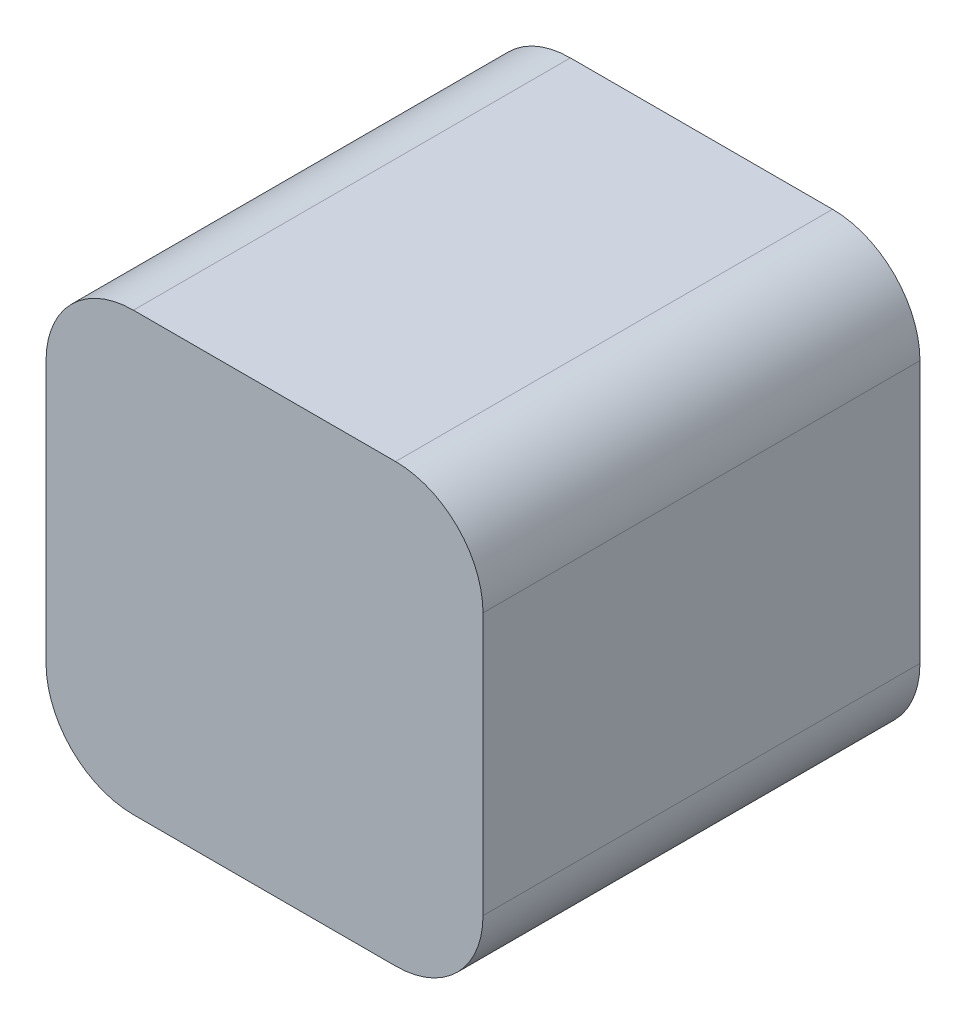
ISO-10303-21;
HEADER;
FILE_DESCRIPTION(('STEP AP214'),'2;1');
FILE_NAME('part.step','',(''),(''),'','','');
FILE_SCHEMA(('AUTOMOTIVE_DESIGN { 1 0 10303 214 1 1 1 1 }'));
ENDSEC;
DATA;
#1=APPLICATION_CONTEXT('core data for automotive mechanical design processes');
#2=APPLICATION_PROTOCOL_DEFINITION('international standard','automotive_design',2000,#1);
#3=PRODUCT_CONTEXT('',#1,'mechanical');
#4=PRODUCT('Part','Part','',(#3));
#5=PRODUCT_RELATED_PRODUCT_CATEGORY('part','',(#4));
#6=PRODUCT_DEFINITION_FORMATION('','',#4);
#7=PRODUCT_DEFINITION_CONTEXT('part definition',#1,'design');
#8=PRODUCT_DEFINITION('design','',#6,#7);
#9=PRODUCT_DEFINITION_SHAPE('','',#8);
#10=(LENGTH_UNIT() NAMED_UNIT(*) SI_UNIT(.MILLI.,.METRE.));
#11=(NAMED_UNIT(*) PLANE_ANGLE_UNIT() SI_UNIT($,.RADIAN.));
#12=(NAMED_UNIT(*) SI_UNIT($,.STERADIAN.) SOLID_ANGLE_UNIT());
#13=UNCERTAINTY_MEASURE_WITH_UNIT(LENGTH_MEASURE(1.E-05),#10,'distance_accuracy_value','');
#14=(GEOMETRIC_REPRESENTATION_CONTEXT(3) GLOBAL_UNCERTAINTY_ASSIGNED_CONTEXT((#13)) GLOBAL_UNIT_ASSIGNED_CONTEXT((#10,
#11,#12)) REPRESENTATION_CONTEXT('',''));
#15=CARTESIAN_POINT('',(0.,0.,0.));
#16=DIRECTION('',(0.,0.,1.));
#17=DIRECTION('',(1.,0.,0.));
#18=AXIS2_PLACEMENT_3D('',#15,#16,#17);
#19=CARTESIAN_POINT('',(50.,0.,0.));
#20=DIRECTION('',(0.,0.,-1.));
#21=DIRECTION('',(-1.,0.,0.));
#22=AXIS2_PLACEMENT_3D('',#19,#20,#21);
#23=PLANE('',#22);
#24=DIRECTION('',(0.,-1.,0.));
#25=VECTOR('',#24,1.);
#26=CARTESIAN_POINT('',(50.,0.,0.));
#27=LINE('',#26,#25);
#28=CARTESIAN_POINT('',(50.,40.,0.));
#29=VERTEX_POINT('',#28);
#30=CARTESIAN_POINT('',(50.,10.,0.));
#31=VERTEX_POINT('',#30);
#32=EDGE_CURVE('E116',#29,#31,#27,.T.);
#33=ORIENTED_EDGE('',*,*,#32,.F.);
#34=CARTESIAN_POINT('',(40.,40.,0.));
#35=DIRECTION('',(0.,0.,-1.));
#36=DIRECTION('',(-1.,0.,0.));
#37=AXIS2_PLACEMENT_3D('',#34,#35,#36);
#38=CIRCLE('',#37,10.);
#39=CARTESIAN_POINT('',(40.,50.,0.));
#40=VERTEX_POINT('',#39);
#41=EDGE_CURVE('E98',#29,#40,#38,.F.);
#42=ORIENTED_EDGE('',*,*,#41,.T.);
#43=DIRECTION('',(-1.,0.,0.));
#44=VECTOR('',#43,1.);
#45=CARTESIAN_POINT('',(50.,50.,0.));
#46=LINE('',#45,#44);
#47=CARTESIAN_POINT('',(10.,50.,0.));
#48=VERTEX_POINT('',#47);
#49=EDGE_CURVE('E126',#40,#48,#46,.T.);
#50=ORIENTED_EDGE('',*,*,#49,.T.);
#51=CARTESIAN_POINT('',(10.,40.,0.));
#52=DIRECTION('',(0.,0.,-1.));
#53=DIRECTION('',(-1.,0.,0.));
#54=AXIS2_PLACEMENT_3D('',#51,#52,#53);
#55=CIRCLE('',#54,10.);
#56=CARTESIAN_POINT('',(0.,40.,0.));
#57=VERTEX_POINT('',#56);
#58=EDGE_CURVE('E119',#48,#57,#55,.F.);
#59=ORIENTED_EDGE('',*,*,#58,.T.);
#60=DIRECTION('',(0.,-1.,0.));
#61=VECTOR('',#60,1.);
#62=CARTESIAN_POINT('',(0.,0.,0.));
#63=LINE('',#62,#61);
#64=CARTESIAN_POINT('',(0.,10.,0.));
#65=VERTEX_POINT('',#64);
#66=EDGE_CURVE('E129',#57,#65,#63,.T.);
#67=ORIENTED_EDGE('',*,*,#66,.T.);
#68=CARTESIAN_POINT('',(10.,10.,0.));
#69=DIRECTION('',(0.,0.,-1.));
#70=DIRECTION('',(-1.,0.,0.));
#71=AXIS2_PLACEMENT_3D('',#68,#69,#70);
#72=CIRCLE('',#71,10.);
#73=CARTESIAN_POINT('',(10.,0.,0.));
#74=VERTEX_POINT('',#73);
#75=EDGE_CURVE('E145',#65,#74,#72,.F.);
#76=ORIENTED_EDGE('',*,*,#75,.T.);
#77=DIRECTION('',(-1.,0.,0.));
#78=VECTOR('',#77,1.);
#79=CARTESIAN_POINT('',(50.,0.,0.));
#80=LINE('',#79,#78);
#81=CARTESIAN_POINT('',(40.,0.,0.));
#82=VERTEX_POINT('',#81);
#83=EDGE_CURVE('E140',#82,#74,#80,.T.);
#84=ORIENTED_EDGE('',*,*,#83,.F.);
#85=CARTESIAN_POINT('',(40.,10.,0.));
#86=DIRECTION('',(0.,0.,-1.));
#87=DIRECTION('',(-1.,0.,0.));
#88=AXIS2_PLACEMENT_3D('',#85,#86,#87);
#89=CIRCLE('',#88,10.);
#90=EDGE_CURVE('E109',#82,#31,#89,.F.);
#91=ORIENTED_EDGE('',*,*,#90,.T.);
#92=EDGE_LOOP('',(#33,#42,#50,#59,#67,#76,#84,#91));
#93=FACE_BOUND('',#92,.T.);
#94=ADVANCED_FACE('F32',(#93),#23,.F.);
#95=CARTESIAN_POINT('',(50.,0.,0.));
#96=DIRECTION('',(0.,1.,0.));
#97=DIRECTION('',(0.,0.,1.));
#98=AXIS2_PLACEMENT_3D('',#95,#96,#97);
#99=PLANE('',#98);
#100=DIRECTION('',(-1.,0.,0.));
#101=VECTOR('',#100,1.);
#102=CARTESIAN_POINT('',(50.,0.,-50.));
#103=LINE('',#102,#101);
#104=CARTESIAN_POINT('',(40.,0.,-50.));
#105=VERTEX_POINT('',#104);
#106=CARTESIAN_POINT('',(10.,0.,-50.));
#107=VERTEX_POINT('',#106);
#108=EDGE_CURVE('E138',#105,#107,#103,.T.);
#109=ORIENTED_EDGE('',*,*,#108,.F.);
#110=DIRECTION('',(0.,0.,-1.));
#111=VECTOR('',#110,1.);
#112=CARTESIAN_POINT('',(40.,0.,0.));
#113=LINE('',#112,#111);
#114=EDGE_CURVE('E159',#105,#82,#113,.F.);
#115=ORIENTED_EDGE('',*,*,#114,.T.);
#116=ORIENTED_EDGE('',*,*,#83,.T.);
#117=DIRECTION('',(0.,0.,-1.));
#118=VECTOR('',#117,1.);
#119=CARTESIAN_POINT('',(10.,0.,-50.));
#120=LINE('',#119,#118);
#121=EDGE_CURVE('E157',#74,#107,#120,.T.);
#122=ORIENTED_EDGE('',*,*,#121,.T.);
#123=EDGE_LOOP('',(#109,#115,#116,#122));
#124=FACE_BOUND('',#123,.T.);
#125=ADVANCED_FACE('F175',(#124),#99,.F.);
#126=CARTESIAN_POINT('',(50.,0.,-50.));
#127=DIRECTION('',(0.,0.,1.));
#128=DIRECTION('',(1.,0.,0.));
#129=AXIS2_PLACEMENT_3D('',#126,#127,#128);
#130=PLANE('',#129);
#131=DIRECTION('',(-1.,0.,0.));
#132=VECTOR('',#131,1.);
#133=CARTESIAN_POINT('',(50.,50.,-50.));
#134=LINE('',#133,#132);
#135=CARTESIAN_POINT('',(40.,50.,-50.));
#136=VERTEX_POINT('',#135);
#137=CARTESIAN_POINT('',(10.,50.,-50.));
#138=VERTEX_POINT('',#137);
#139=EDGE_CURVE('E135',#136,#138,#134,.T.);
#140=ORIENTED_EDGE('',*,*,#139,.F.);
#141=CARTESIAN_POINT('',(40.,40.,-50.));
#142=DIRECTION('',(0.,0.,1.));
#143=DIRECTION('',(1.,0.,0.));
#144=AXIS2_PLACEMENT_3D('',#141,#142,#143);
#145=CIRCLE('',#144,10.);
#146=CARTESIAN_POINT('',(50.,40.,-50.));
#147=VERTEX_POINT('',#146);
#148=EDGE_CURVE('E155',#136,#147,#145,.F.);
#149=ORIENTED_EDGE('',*,*,#148,.T.);
#150=DIRECTION('',(0.,1.,0.));
#151=VECTOR('',#150,1.);
#152=CARTESIAN_POINT('',(50.,0.,-50.));
#153=LINE('',#152,#151);
#154=CARTESIAN_POINT('',(50.,10.,-50.));
#155=VERTEX_POINT('',#154);
#156=EDGE_CURVE('E118',#155,#147,#153,.T.);
#157=ORIENTED_EDGE('',*,*,#156,.F.);
#158=CARTESIAN_POINT('',(40.,10.,-50.));
#159=DIRECTION('',(0.,0.,1.));
#160=DIRECTION('',(1.,0.,0.));
#161=AXIS2_PLACEMENT_3D('',#158,#159,#160);
#162=CIRCLE('',#161,10.);
#163=EDGE_CURVE('E55',#155,#105,#162,.F.);
#164=ORIENTED_EDGE('',*,*,#163,.T.);
#165=ORIENTED_EDGE('',*,*,#108,.T.);
#166=CARTESIAN_POINT('',(10.,10.,-50.));
#167=DIRECTION('',(0.,0.,1.));
#168=DIRECTION('',(1.,0.,0.));
#169=AXIS2_PLACEMENT_3D('',#166,#167,#168);
#170=CIRCLE('',#169,10.);
#171=CARTESIAN_POINT('',(0.,10.,-50.));
#172=VERTEX_POINT('',#171);
#173=EDGE_CURVE('E47',#107,#172,#170,.F.);
#174=ORIENTED_EDGE('',*,*,#173,.T.);
#175=DIRECTION('',(0.,1.,0.));
#176=VECTOR('',#175,1.);
#177=CARTESIAN_POINT('',(0.,0.,-50.));
#178=LINE('',#177,#176);
#179=CARTESIAN_POINT('',(0.,40.,-50.));
#180=VERTEX_POINT('',#179);
#181=EDGE_CURVE('E124',#172,#180,#178,.T.);
#182=ORIENTED_EDGE('',*,*,#181,.T.);
#183=CARTESIAN_POINT('',(10.,40.,-50.));
#184=DIRECTION('',(0.,0.,1.));
#185=DIRECTION('',(1.,0.,0.));
#186=AXIS2_PLACEMENT_3D('',#183,#184,#185);
#187=CIRCLE('',#186,10.);
#188=EDGE_CURVE('E151',#180,#138,#187,.F.);
#189=ORIENTED_EDGE('',*,*,#188,.T.);
#190=EDGE_LOOP('',(#140,#149,#157,#164,#165,#174,#182,#189));
#191=FACE_BOUND('',#190,.T.);
#192=ADVANCED_FACE('F168',(#191),#130,.F.);
#193=CARTESIAN_POINT('',(50.,50.,0.));
#194=DIRECTION('',(0.,-1.,0.));
#195=DIRECTION('',(0.,0.,-1.));
#196=AXIS2_PLACEMENT_3D('',#193,#194,#195);
#197=PLANE('',#196);
#198=ORIENTED_EDGE('',*,*,#49,.F.);
#199=DIRECTION('',(0.,0.,1.));
#200=VECTOR('',#199,1.);
#201=CARTESIAN_POINT('',(40.,50.,0.));
#202=LINE('',#201,#200);
#203=EDGE_CURVE('E103',#40,#136,#202,.F.);
#204=ORIENTED_EDGE('',*,*,#203,.T.);
#205=ORIENTED_EDGE('',*,*,#139,.T.);
#206=DIRECTION('',(0.,0.,1.));
#207=VECTOR('',#206,1.);
#208=CARTESIAN_POINT('',(10.,50.,0.));
#209=LINE('',#208,#207);
#210=EDGE_CURVE('E108',#138,#48,#209,.T.);
#211=ORIENTED_EDGE('',*,*,#210,.T.);
#212=EDGE_LOOP('',(#198,#204,#205,#211));
#213=FACE_BOUND('',#212,.T.);
#214=ADVANCED_FACE('F171',(#213),#197,.F.);
#215=CARTESIAN_POINT('',(50.,0.,0.));
#216=DIRECTION('',(-1.,0.,0.));
#217=DIRECTION('',(0.,0.,1.));
#218=AXIS2_PLACEMENT_3D('',#215,#216,#217);
#219=PLANE('',#218);
#220=ORIENTED_EDGE('',*,*,#156,.T.);
#221=DIRECTION('',(0.,0.,1.));
#222=VECTOR('',#221,1.);
#223=CARTESIAN_POINT('',(50.,40.,0.));
#224=LINE('',#223,#222);
#225=EDGE_CURVE('E102',#147,#29,#224,.T.);
#226=ORIENTED_EDGE('',*,*,#225,.T.);
#227=ORIENTED_EDGE('',*,*,#32,.T.);
#228=DIRECTION('',(0.,0.,-1.));
#229=VECTOR('',#228,1.);
#230=CARTESIAN_POINT('',(50.,10.,0.));
#231=LINE('',#230,#229);
#232=EDGE_CURVE('E120',#31,#155,#231,.T.);
#233=ORIENTED_EDGE('',*,*,#232,.T.);
#234=EDGE_LOOP('',(#220,#226,#227,#233));
#235=FACE_BOUND('',#234,.T.);
#236=ADVANCED_FACE('F114',(#235),#219,.F.);
#237=CARTESIAN_POINT('',(0.,0.,0.));
#238=DIRECTION('',(-1.,0.,0.));
#239=DIRECTION('',(0.,0.,1.));
#240=AXIS2_PLACEMENT_3D('',#237,#238,#239);
#241=PLANE('',#240);
#242=ORIENTED_EDGE('',*,*,#181,.F.);
#243=DIRECTION('',(0.,0.,-1.));
#244=VECTOR('',#243,1.);
#245=CARTESIAN_POINT('',(0.,10.,0.));
#246=LINE('',#245,#244);
#247=EDGE_CURVE('E11',#172,#65,#246,.F.);
#248=ORIENTED_EDGE('',*,*,#247,.T.);
#249=ORIENTED_EDGE('',*,*,#66,.F.);
#250=DIRECTION('',(0.,0.,1.));
#251=VECTOR('',#250,1.);
#252=CARTESIAN_POINT('',(0.,40.,-50.));
#253=LINE('',#252,#251);
#254=EDGE_CURVE('E40',#57,#180,#253,.F.);
#255=ORIENTED_EDGE('',*,*,#254,.T.);
#256=EDGE_LOOP('',(#242,#248,#249,#255));
#257=FACE_BOUND('',#256,.T.);
#258=ADVANCED_FACE('F164',(#257),#241,.T.);
#259=CARTESIAN_POINT('',(40.,40.,0.));
#260=DIRECTION('',(0.,0.,1.));
#261=DIRECTION('',(1.,0.,0.));
#262=AXIS2_PLACEMENT_3D('',#259,#260,#261);
#263=CYLINDRICAL_SURFACE('',#262,10.);
#264=ORIENTED_EDGE('',*,*,#148,.F.);
#265=ORIENTED_EDGE('',*,*,#203,.F.);
#266=ORIENTED_EDGE('',*,*,#41,.F.);
#267=ORIENTED_EDGE('',*,*,#225,.F.);
#268=EDGE_LOOP('',(#264,#265,#266,#267));
#269=FACE_BOUND('',#268,.T.);
#270=ADVANCED_FACE('F101',(#269),#263,.T.);
#271=CARTESIAN_POINT('',(40.,10.,0.));
#272=DIRECTION('',(0.,0.,-1.));
#273=DIRECTION('',(-1.,0.,0.));
#274=AXIS2_PLACEMENT_3D('',#271,#272,#273);
#275=CYLINDRICAL_SURFACE('',#274,10.);
#276=ORIENTED_EDGE('',*,*,#90,.F.);
#277=ORIENTED_EDGE('',*,*,#114,.F.);
#278=ORIENTED_EDGE('',*,*,#163,.F.);
#279=ORIENTED_EDGE('',*,*,#232,.F.);
#280=EDGE_LOOP('',(#276,#277,#278,#279));
#281=FACE_BOUND('',#280,.T.);
#282=ADVANCED_FACE('F178',(#281),#275,.T.);
#283=CARTESIAN_POINT('',(10.,10.,0.));
#284=DIRECTION('',(0.,0.,1.));
#285=DIRECTION('',(1.,0.,0.));
#286=AXIS2_PLACEMENT_3D('',#283,#284,#285);
#287=CYLINDRICAL_SURFACE('',#286,10.);
#288=ORIENTED_EDGE('',*,*,#75,.F.);
#289=ORIENTED_EDGE('',*,*,#247,.F.);
#290=ORIENTED_EDGE('',*,*,#173,.F.);
#291=ORIENTED_EDGE('',*,*,#121,.F.);
#292=EDGE_LOOP('',(#288,#289,#290,#291));
#293=FACE_BOUND('',#292,.T.);
#294=ADVANCED_FACE('F173',(#293),#287,.T.);
#295=CARTESIAN_POINT('',(10.,40.,0.));
#296=DIRECTION('',(0.,0.,-1.));
#297=DIRECTION('',(-1.,0.,0.));
#298=AXIS2_PLACEMENT_3D('',#295,#296,#297);
#299=CYLINDRICAL_SURFACE('',#298,10.);
#300=ORIENTED_EDGE('',*,*,#188,.F.);
#301=ORIENTED_EDGE('',*,*,#254,.F.);
#302=ORIENTED_EDGE('',*,*,#58,.F.);
#303=ORIENTED_EDGE('',*,*,#210,.F.);
#304=EDGE_LOOP('',(#300,#301,#302,#303));
#305=FACE_BOUND('',#304,.T.);
#306=ADVANCED_FACE('F34',(#305),#299,.T.);
#307=CLOSED_SHELL('',(#94,#125,#192,#214,#236,#258,#270,#282,#294,#306));
#308=MANIFOLD_SOLID_BREP('B2',#307);
#309=ADVANCED_BREP_SHAPE_REPRESENTATION('',(#18,#308),#14);
#310=SHAPE_DEFINITION_REPRESENTATION(#9,#309);
ENDSEC;
END-ISO-10303-21;
